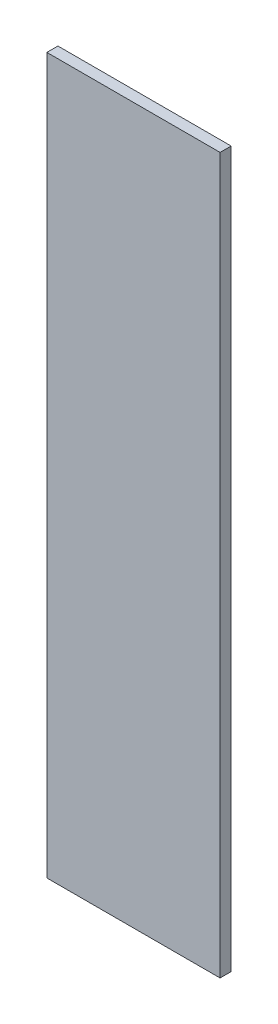
ISO-10303-21;
HEADER;
FILE_DESCRIPTION(('STEP AP214'),'2;1');
FILE_NAME('part.step','',(''),(''),'','','');
FILE_SCHEMA(('AUTOMOTIVE_DESIGN { 1 0 10303 214 1 1 1 1 }'));
ENDSEC;
DATA;
#1=APPLICATION_CONTEXT('core data for automotive mechanical design processes');
#2=APPLICATION_PROTOCOL_DEFINITION('international standard','automotive_design',2000,#1);
#3=PRODUCT_CONTEXT('',#1,'mechanical');
#4=PRODUCT('Part','Part','',(#3));
#5=PRODUCT_RELATED_PRODUCT_CATEGORY('part','',(#4));
#6=PRODUCT_DEFINITION_FORMATION('','',#4);
#7=PRODUCT_DEFINITION_CONTEXT('part definition',#1,'design');
#8=PRODUCT_DEFINITION('design','',#6,#7);
#9=PRODUCT_DEFINITION_SHAPE('','',#8);
#10=(LENGTH_UNIT() NAMED_UNIT(*) SI_UNIT(.MILLI.,.METRE.));
#11=(NAMED_UNIT(*) PLANE_ANGLE_UNIT() SI_UNIT($,.RADIAN.));
#12=(NAMED_UNIT(*) SI_UNIT($,.STERADIAN.) SOLID_ANGLE_UNIT());
#13=UNCERTAINTY_MEASURE_WITH_UNIT(LENGTH_MEASURE(1.E-05),#10,'distance_accuracy_value','');
#14=(GEOMETRIC_REPRESENTATION_CONTEXT(3) GLOBAL_UNCERTAINTY_ASSIGNED_CONTEXT((#13)) GLOBAL_UNIT_ASSIGNED_CONTEXT((#10,
#11,#12)) REPRESENTATION_CONTEXT('',''));
#15=CARTESIAN_POINT('',(0.,0.,0.));
#16=DIRECTION('',(0.,0.,1.));
#17=DIRECTION('',(1.,0.,0.));
#18=AXIS2_PLACEMENT_3D('',#15,#16,#17);
#19=CARTESIAN_POINT('',(1499.5,30.,-1020.));
#20=DIRECTION('',(0.,1.,0.));
#21=DIRECTION('',(1.,0.,0.));
#22=AXIS2_PLACEMENT_3D('',#19,#20,#21);
#23=PLANE('',#22);
#24=DIRECTION('',(-1.,0.,0.));
#25=VECTOR('',#24,1.);
#26=CARTESIAN_POINT('',(1499.5,30.,-990.));
#27=LINE('',#26,#25);
#28=CARTESIAN_POINT('',(1499.5,30.0000000000005,-990.));
#29=VERTEX_POINT('',#28);
#30=CARTESIAN_POINT('',(1029.5,30.,-990.));
#31=VERTEX_POINT('',#30);
#32=EDGE_CURVE('E61',#29,#31,#27,.T.);
#33=ORIENTED_EDGE('',*,*,#32,.T.);
#34=DIRECTION('',(0.,0.,1.));
#35=VECTOR('',#34,1.);
#36=CARTESIAN_POINT('',(1029.5,30.,-1020.));
#37=LINE('',#36,#35);
#38=CARTESIAN_POINT('',(1029.5,30.,-1020.));
#39=VERTEX_POINT('',#38);
#40=EDGE_CURVE('E11',#39,#31,#37,.T.);
#41=ORIENTED_EDGE('',*,*,#40,.F.);
#42=DIRECTION('',(-1.,0.,0.));
#43=VECTOR('',#42,1.);
#44=CARTESIAN_POINT('',(1499.5,30.,-1020.));
#45=LINE('',#44,#43);
#46=CARTESIAN_POINT('',(1499.5,30.0000000000005,-1020.));
#47=VERTEX_POINT('',#46);
#48=EDGE_CURVE('E80',#47,#39,#45,.T.);
#49=ORIENTED_EDGE('',*,*,#48,.F.);
#50=DIRECTION('',(0.,0.,1.));
#51=VECTOR('',#50,1.);
#52=CARTESIAN_POINT('',(1499.5,30.0000000000005,-1020.));
#53=LINE('',#52,#51);
#54=EDGE_CURVE('E73',#47,#29,#53,.T.);
#55=ORIENTED_EDGE('',*,*,#54,.T.);
#56=EDGE_LOOP('',(#33,#41,#49,#55));
#57=FACE_BOUND('',#56,.T.);
#58=ADVANCED_FACE('F17',(#57),#23,.F.);
#59=CARTESIAN_POINT('',(1029.5,30.,-1020.));
#60=DIRECTION('',(1.,0.,0.));
#61=DIRECTION('',(0.,-1.,0.));
#62=AXIS2_PLACEMENT_3D('',#59,#60,#61);
#63=PLANE('',#62);
#64=DIRECTION('',(0.,1.,0.));
#65=VECTOR('',#64,1.);
#66=CARTESIAN_POINT('',(1029.5,30.,-990.));
#67=LINE('',#66,#65);
#68=CARTESIAN_POINT('',(1029.5,1970.,-990.));
#69=VERTEX_POINT('',#68);
#70=EDGE_CURVE('E57',#31,#69,#67,.T.);
#71=ORIENTED_EDGE('',*,*,#70,.T.);
#72=DIRECTION('',(0.,0.,1.));
#73=VECTOR('',#72,1.);
#74=CARTESIAN_POINT('',(1029.5,1970.,-1020.));
#75=LINE('',#74,#73);
#76=CARTESIAN_POINT('',(1029.5,1970.,-1020.));
#77=VERTEX_POINT('',#76);
#78=EDGE_CURVE('E24',#77,#69,#75,.T.);
#79=ORIENTED_EDGE('',*,*,#78,.F.);
#80=DIRECTION('',(0.,1.,0.));
#81=VECTOR('',#80,1.);
#82=CARTESIAN_POINT('',(1029.5,30.,-1020.));
#83=LINE('',#82,#81);
#84=EDGE_CURVE('E69',#39,#77,#83,.T.);
#85=ORIENTED_EDGE('',*,*,#84,.F.);
#86=ORIENTED_EDGE('',*,*,#40,.T.);
#87=EDGE_LOOP('',(#71,#79,#85,#86));
#88=FACE_BOUND('',#87,.T.);
#89=ADVANCED_FACE('F68',(#88),#63,.F.);
#90=CARTESIAN_POINT('',(1029.5,1970.,-1020.));
#91=DIRECTION('',(0.,-1.,0.));
#92=DIRECTION('',(-1.,0.,0.));
#93=AXIS2_PLACEMENT_3D('',#90,#91,#92);
#94=PLANE('',#93);
#95=DIRECTION('',(1.,0.,0.));
#96=VECTOR('',#95,1.);
#97=CARTESIAN_POINT('',(1029.5,1970.,-990.));
#98=LINE('',#97,#96);
#99=CARTESIAN_POINT('',(1499.5,1970.,-990.));
#100=VERTEX_POINT('',#99);
#101=EDGE_CURVE('E62',#69,#100,#98,.T.);
#102=ORIENTED_EDGE('',*,*,#101,.T.);
#103=DIRECTION('',(0.,0.,1.));
#104=VECTOR('',#103,1.);
#105=CARTESIAN_POINT('',(1499.5,1970.,-1020.));
#106=LINE('',#105,#104);
#107=CARTESIAN_POINT('',(1499.5,1970.,-1020.));
#108=VERTEX_POINT('',#107);
#109=EDGE_CURVE('E85',#108,#100,#106,.T.);
#110=ORIENTED_EDGE('',*,*,#109,.F.);
#111=DIRECTION('',(1.,0.,0.));
#112=VECTOR('',#111,1.);
#113=CARTESIAN_POINT('',(1029.5,1970.,-1020.));
#114=LINE('',#113,#112);
#115=EDGE_CURVE('E36',#77,#108,#114,.T.);
#116=ORIENTED_EDGE('',*,*,#115,.F.);
#117=ORIENTED_EDGE('',*,*,#78,.T.);
#118=EDGE_LOOP('',(#102,#110,#116,#117));
#119=FACE_BOUND('',#118,.T.);
#120=ADVANCED_FACE('F88',(#119),#94,.F.);
#121=CARTESIAN_POINT('',(1499.5,1970.,-1020.));
#122=DIRECTION('',(-1.,0.,0.));
#123=DIRECTION('',(0.,1.,0.));
#124=AXIS2_PLACEMENT_3D('',#121,#122,#123);
#125=PLANE('',#124);
#126=DIRECTION('',(0.,-1.,0.));
#127=VECTOR('',#126,1.);
#128=CARTESIAN_POINT('',(1499.5,1970.,-990.));
#129=LINE('',#128,#127);
#130=EDGE_CURVE('E77',#100,#29,#129,.T.);
#131=ORIENTED_EDGE('',*,*,#130,.T.);
#132=ORIENTED_EDGE('',*,*,#54,.F.);
#133=DIRECTION('',(0.,-1.,0.));
#134=VECTOR('',#133,1.);
#135=CARTESIAN_POINT('',(1499.5,1970.,-1020.));
#136=LINE('',#135,#134);
#137=EDGE_CURVE('E31',#108,#47,#136,.T.);
#138=ORIENTED_EDGE('',*,*,#137,.F.);
#139=ORIENTED_EDGE('',*,*,#109,.T.);
#140=EDGE_LOOP('',(#131,#132,#138,#139));
#141=FACE_BOUND('',#140,.T.);
#142=ADVANCED_FACE('F90',(#141),#125,.F.);
#143=CARTESIAN_POINT('',(1029.5,30.,-1020.));
#144=DIRECTION('',(0.,0.,-1.));
#145=DIRECTION('',(0.,-1.,0.));
#146=AXIS2_PLACEMENT_3D('',#143,#144,#145);
#147=PLANE('',#146);
#148=ORIENTED_EDGE('',*,*,#48,.T.);
#149=ORIENTED_EDGE('',*,*,#84,.T.);
#150=ORIENTED_EDGE('',*,*,#115,.T.);
#151=ORIENTED_EDGE('',*,*,#137,.T.);
#152=EDGE_LOOP('',(#148,#149,#150,#151));
#153=FACE_BOUND('',#152,.T.);
#154=ADVANCED_FACE('F91',(#153),#147,.T.);
#155=CARTESIAN_POINT('',(1029.5,30.,-990.));
#156=DIRECTION('',(0.,0.,-1.));
#157=DIRECTION('',(0.,-1.,0.));
#158=AXIS2_PLACEMENT_3D('',#155,#156,#157);
#159=PLANE('',#158);
#160=ORIENTED_EDGE('',*,*,#32,.F.);
#161=ORIENTED_EDGE('',*,*,#130,.F.);
#162=ORIENTED_EDGE('',*,*,#101,.F.);
#163=ORIENTED_EDGE('',*,*,#70,.F.);
#164=EDGE_LOOP('',(#160,#161,#162,#163));
#165=FACE_BOUND('',#164,.T.);
#166=ADVANCED_FACE('F58',(#165),#159,.F.);
#167=CLOSED_SHELL('',(#58,#89,#120,#142,#154,#166));
#168=MANIFOLD_SOLID_BREP('B1',#167);
#169=ADVANCED_BREP_SHAPE_REPRESENTATION('',(#18,#168),#14);
#170=SHAPE_DEFINITION_REPRESENTATION(#9,#169);
ENDSEC;
END-ISO-10303-21;
